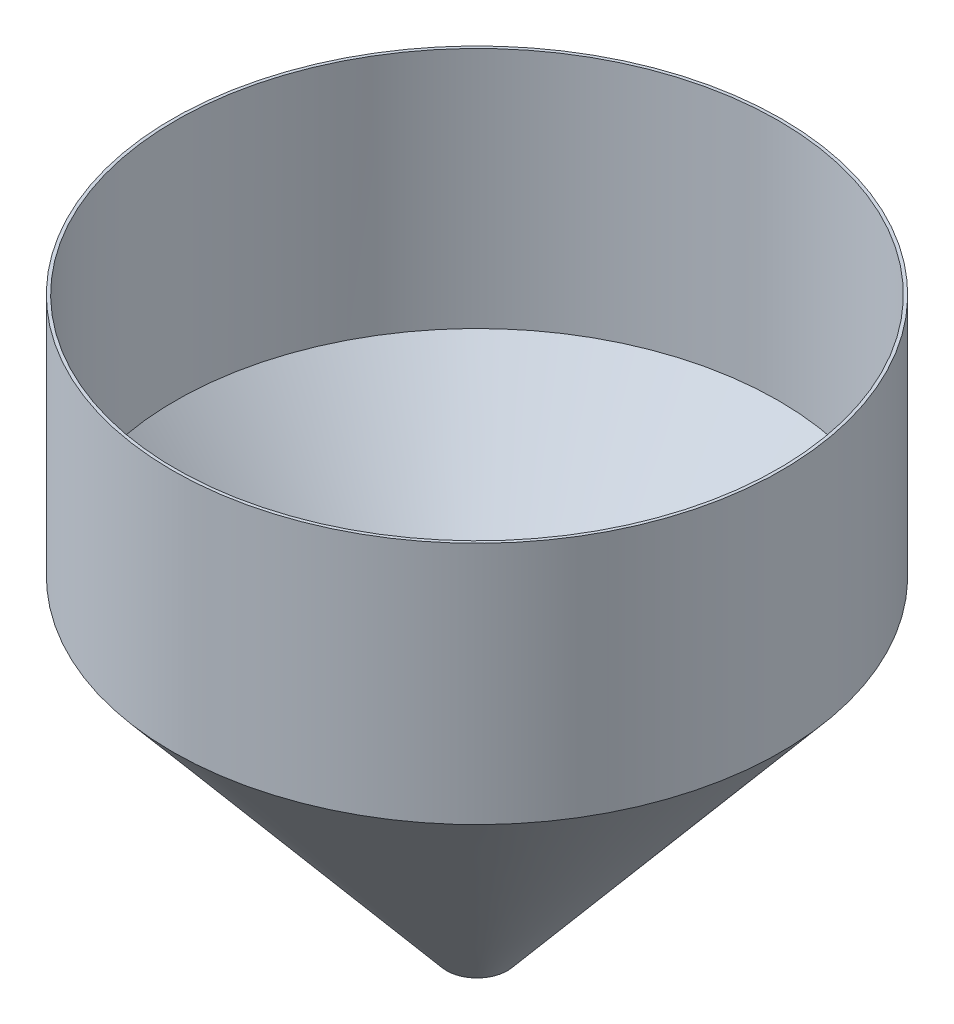
ISO-10303-21;
HEADER;
FILE_DESCRIPTION(('STEP AP214'),'2;1');
FILE_NAME('part.step','',(''),(''),'','','');
FILE_SCHEMA(('AUTOMOTIVE_DESIGN { 1 0 10303 214 1 1 1 1 }'));
ENDSEC;
DATA;
#1=APPLICATION_CONTEXT('core data for automotive mechanical design processes');
#2=APPLICATION_PROTOCOL_DEFINITION('international standard','automotive_design',2000,#1);
#3=PRODUCT_CONTEXT('',#1,'mechanical');
#4=PRODUCT('Part','Part','',(#3));
#5=PRODUCT_RELATED_PRODUCT_CATEGORY('part','',(#4));
#6=PRODUCT_DEFINITION_FORMATION('','',#4);
#7=PRODUCT_DEFINITION_CONTEXT('part definition',#1,'design');
#8=PRODUCT_DEFINITION('design','',#6,#7);
#9=PRODUCT_DEFINITION_SHAPE('','',#8);
#10=(LENGTH_UNIT() NAMED_UNIT(*) SI_UNIT(.MILLI.,.METRE.));
#11=(NAMED_UNIT(*) PLANE_ANGLE_UNIT() SI_UNIT($,.RADIAN.));
#12=(NAMED_UNIT(*) SI_UNIT($,.STERADIAN.) SOLID_ANGLE_UNIT());
#13=UNCERTAINTY_MEASURE_WITH_UNIT(LENGTH_MEASURE(1.E-05),#10,'distance_accuracy_value','');
#14=(GEOMETRIC_REPRESENTATION_CONTEXT(3) GLOBAL_UNCERTAINTY_ASSIGNED_CONTEXT((#13)) GLOBAL_UNIT_ASSIGNED_CONTEXT((#10,
#11,#12)) REPRESENTATION_CONTEXT('',''));
#15=CARTESIAN_POINT('',(0.,0.,0.));
#16=DIRECTION('',(0.,0.,1.));
#17=DIRECTION('',(1.,0.,0.));
#18=AXIS2_PLACEMENT_3D('',#15,#16,#17);
#19=CARTESIAN_POINT('',(-100.,187.257823333478,0.));
#20=DIRECTION('',(0.,-1.,0.));
#21=DIRECTION('',(0.,0.,-1.));
#22=AXIS2_PLACEMENT_3D('',#19,#20,#21);
#23=PLANE('',#22);
#24=CARTESIAN_POINT('',(0.,187.257823333478,0.));
#25=DIRECTION('',(0.,-1.,0.));
#26=DIRECTION('',(0.,0.,-1.));
#27=AXIS2_PLACEMENT_3D('',#24,#25,#26);
#28=CIRCLE('',#27,99.);
#29=CARTESIAN_POINT('',(0.,187.257823333478,-99.));
#30=VERTEX_POINT('',#29);
#31=EDGE_CURVE('E63',#30,#30,#28,.T.);
#32=ORIENTED_EDGE('',*,*,#31,.T.);
#33=EDGE_LOOP('',(#32));
#34=FACE_BOUND('',#33,.T.);
#35=CARTESIAN_POINT('',(0.,187.257823333478,0.));
#36=DIRECTION('',(0.,-1.,0.));
#37=DIRECTION('',(0.,0.,-1.));
#38=AXIS2_PLACEMENT_3D('',#35,#36,#37);
#39=CIRCLE('',#38,100.);
#40=CARTESIAN_POINT('',(0.,187.257823333478,-100.));
#41=VERTEX_POINT('',#40);
#42=EDGE_CURVE('E55',#41,#41,#39,.T.);
#43=ORIENTED_EDGE('',*,*,#42,.F.);
#44=EDGE_LOOP('',(#43));
#45=FACE_BOUND('',#44,.T.);
#46=ADVANCED_FACE('F43',(#34,#45),#23,.F.);
#47=CARTESIAN_POINT('',(0.,0.,0.));
#48=DIRECTION('',(0.,1.,0.));
#49=DIRECTION('',(0.,0.,1.));
#50=AXIS2_PLACEMENT_3D('',#47,#48,#49);
#51=PLANE('',#50);
#52=CARTESIAN_POINT('',(0.,0.,0.));
#53=DIRECTION('',(0.,1.,0.));
#54=DIRECTION('',(0.,0.,1.));
#55=AXIS2_PLACEMENT_3D('',#52,#53,#54);
#56=CIRCLE('',#55,8.69459271066771);
#57=CARTESIAN_POINT('',(0.,0.,8.69459271066769));
#58=VERTEX_POINT('',#57);
#59=EDGE_CURVE('E60',#58,#58,#56,.F.);
#60=ORIENTED_EDGE('',*,*,#59,.F.);
#61=EDGE_LOOP('',(#60));
#62=FACE_BOUND('',#61,.T.);
#63=CARTESIAN_POINT('',(0.,0.,0.));
#64=DIRECTION('',(0.,-1.,0.));
#65=DIRECTION('',(0.,0.,-1.));
#66=AXIS2_PLACEMENT_3D('',#63,#64,#65);
#67=CIRCLE('',#66,9.99999999999998);
#68=CARTESIAN_POINT('',(0.,0.,9.99999999999998));
#69=VERTEX_POINT('',#68);
#70=EDGE_CURVE('E10',#69,#69,#67,.T.);
#71=ORIENTED_EDGE('',*,*,#70,.T.);
#72=EDGE_LOOP('',(#71));
#73=FACE_BOUND('',#72,.T.);
#74=ADVANCED_FACE('F93',(#62,#73),#51,.F.);
#75=CARTESIAN_POINT('',(0.,107.257823333478,0.));
#76=DIRECTION('',(0.,1.,0.));
#77=DIRECTION('',(0.,0.,1.));
#78=AXIS2_PLACEMENT_3D('',#75,#76,#77);
#79=CONICAL_SURFACE('',#78,100.,0.698131700797737);
#80=CARTESIAN_POINT('',(0.,107.257823333478,0.));
#81=DIRECTION('',(0.,-1.,0.));
#82=DIRECTION('',(0.,0.,-1.));
#83=AXIS2_PLACEMENT_3D('',#80,#81,#82);
#84=CIRCLE('',#83,100.);
#85=CARTESIAN_POINT('',(0.,107.257823333478,100.));
#86=VERTEX_POINT('',#85);
#87=EDGE_CURVE('E50',#86,#86,#84,.T.);
#88=CARTESIAN_POINT('',(0.,0.,9.99999999999998));
#89=CARTESIAN_POINT('',(0.,1.11726899305705,10.9375));
#90=CARTESIAN_POINT('',(0.,2.23453798611411,11.875));
#91=CARTESIAN_POINT('',(0.,4.46907597222823,13.75));
#92=CARTESIAN_POINT('',(0.,5.5863449652853,14.6875));
#93=CARTESIAN_POINT('',(0.,7.82088295139942,16.5625));
#94=CARTESIAN_POINT('',(0.,8.93815194445648,17.5));
#95=CARTESIAN_POINT('',(0.,11.1726899305706,19.375));
#96=CARTESIAN_POINT('',(0.,12.2899589236276,20.3125));
#97=CARTESIAN_POINT('',(0.,14.5244969097418,22.1875));
#98=CARTESIAN_POINT('',(0.,15.6417659027988,23.125));
#99=CARTESIAN_POINT('',(0.,17.876303888913,25.));
#100=CARTESIAN_POINT('',(0.,18.99357288197,25.9375));
#101=CARTESIAN_POINT('',(0.,21.2281108680841,27.8125));
#102=CARTESIAN_POINT('',(0.,22.3453798611412,28.75));
#103=CARTESIAN_POINT('',(0.,24.5799178472553,30.625));
#104=CARTESIAN_POINT('',(0.,25.6971868403124,31.5625));
#105=CARTESIAN_POINT('',(0.,27.9317248264265,33.4375));
#106=CARTESIAN_POINT('',(0.,29.0489938194835,34.375));
#107=CARTESIAN_POINT('',(0.,31.2835318055977,36.25));
#108=CARTESIAN_POINT('',(0.,32.4008007986547,37.1875));
#109=CARTESIAN_POINT('',(0.,34.6353387847688,39.0625));
#110=CARTESIAN_POINT('',(0.,35.7526077778259,40.));
#111=CARTESIAN_POINT('',(0.,37.98714576394,41.875));
#112=CARTESIAN_POINT('',(0.,39.1044147569971,42.8125));
#113=CARTESIAN_POINT('',(0.,41.3389527431112,44.6875));
#114=CARTESIAN_POINT('',(0.,42.4562217361683,45.625));
#115=CARTESIAN_POINT('',(0.,44.6907597222824,47.5));
#116=CARTESIAN_POINT('',(0.,45.8080287153394,48.4375));
#117=CARTESIAN_POINT('',(0.,48.0425667014536,50.3125));
#118=CARTESIAN_POINT('',(0.,49.1598356945106,51.25));
#119=CARTESIAN_POINT('',(0.,51.3943736806247,53.125));
#120=CARTESIAN_POINT('',(0.,52.5116426736818,54.0625));
#121=CARTESIAN_POINT('',(0.,54.7461806597959,55.9375));
#122=CARTESIAN_POINT('',(0.,55.863449652853,56.875));
#123=CARTESIAN_POINT('',(0.,58.0979876389671,58.75));
#124=CARTESIAN_POINT('',(0.,59.2152566320241,59.6875));
#125=CARTESIAN_POINT('',(0.,61.4497946181383,61.5625));
#126=CARTESIAN_POINT('',(0.,62.5670636111953,62.5));
#127=CARTESIAN_POINT('',(0.,64.8016015973094,64.375));
#128=CARTESIAN_POINT('',(0.,65.9188705903665,65.3125));
#129=CARTESIAN_POINT('',(0.,68.1534085764806,67.1875));
#130=CARTESIAN_POINT('',(0.,69.2706775695377,68.125));
#131=CARTESIAN_POINT('',(0.,71.5052155556518,70.));
#132=CARTESIAN_POINT('',(0.,72.6224845487089,70.9375));
#133=CARTESIAN_POINT('',(0.,74.857022534823,72.8125));
#134=CARTESIAN_POINT('',(0.,75.97429152788,73.75));
#135=CARTESIAN_POINT('',(0.,78.2088295139941,75.625));
#136=CARTESIAN_POINT('',(0.,79.3260985070512,76.5625));
#137=CARTESIAN_POINT('',(0.,81.5606364931653,78.4375));
#138=CARTESIAN_POINT('',(0.,82.6779054862224,79.375));
#139=CARTESIAN_POINT('',(0.,84.9124434723365,81.25));
#140=CARTESIAN_POINT('',(0.,86.0297124653936,82.1875));
#141=CARTESIAN_POINT('',(0.,88.2642504515077,84.0625));
#142=CARTESIAN_POINT('',(0.,89.3815194445647,85.));
#143=CARTESIAN_POINT('',(0.,91.6160574306789,86.875));
#144=CARTESIAN_POINT('',(0.,92.7333264237359,87.8125));
#145=CARTESIAN_POINT('',(0.,94.96786440985,89.6875));
#146=CARTESIAN_POINT('',(0.,96.0851334029071,90.625));
#147=CARTESIAN_POINT('',(0.,98.3196713890212,92.5));
#148=CARTESIAN_POINT('',(0.,99.4369403820783,93.4375));
#149=CARTESIAN_POINT('',(0.,101.671478368192,95.3125));
#150=CARTESIAN_POINT('',(0.,102.788747361249,96.25));
#151=CARTESIAN_POINT('',(0.,105.023285347364,98.125));
#152=CARTESIAN_POINT('',(0.,106.140554340421,99.0625));
#153=CARTESIAN_POINT('',(0.,107.257823333478,100.));
#154=B_SPLINE_CURVE_WITH_KNOTS('',3,(#88,#89,#90,#91,#92,#93,#94,#95,#96,#97,#98,#99,#100,#101,
#102,#103,#104,#105,#106,#107,#108,#109,#110,#111,#112,#113,#114,#115,#116,#117,#118,#119,#120,
#121,#122,#123,#124,#125,#126,#127,#128,#129,#130,#131,#132,#133,#134,#135,#136,#137,#138,#139,
#140,#141,#142,#143,#144,#145,#146,#147,#148,#149,#150,#151,#152,#153),.UNSPECIFIED.,.F.,.F.,(4,
2,2,2,2,2,2,2,2,2,2,2,2,2,2,2,2,2,2,2,2,2,2,2,2,2,2,2,2,2,2,2,4),(0.,4.37547326304488,
8.75094652608977,13.1264197891346,17.5018930521795,21.8773663152244,26.2528395782693,
30.6283128413142,35.0037861043591,39.3792593674039,43.7547326304488,48.1302058934937,
52.5056791565386,56.8811524195835,61.2566256826283,65.6320989456732,70.0075722087181,
74.383045471763,78.7585187348079,83.1339919978527,87.5094652608976,91.8849385239425,
96.2604117869874,100.635885050032,105.011358313077,109.386831576122,113.762304839167,
118.137778102212,122.513251365257,126.888724628302,131.264197891346,135.639671154391,
140.015144417436),.UNSPECIFIED.);
#155=EDGE_CURVE('BSEAM89',#69,#86,#154,.T.);
#156=ORIENTED_EDGE('',*,*,#70,.F.);
#157=ORIENTED_EDGE('',*,*,#87,.T.);
#158=ORIENTED_EDGE('',*,*,#155,.T.);
#159=ORIENTED_EDGE('',*,*,#155,.F.);
#160=EDGE_LOOP('',(#156,#158,#157,#159));
#161=FACE_BOUND('',#160,.T.);
#162=ADVANCED_FACE('F89',(#161),#79,.T.);
#163=CARTESIAN_POINT('',(0.,0.,0.));
#164=DIRECTION('',(0.,-1.,0.));
#165=DIRECTION('',(0.,0.,-1.));
#166=AXIS2_PLACEMENT_3D('',#163,#164,#165);
#167=CYLINDRICAL_SURFACE('',#166,100.);
#168=ORIENTED_EDGE('',*,*,#87,.F.);
#169=EDGE_LOOP('',(#168));
#170=FACE_BOUND('',#169,.T.);
#171=ORIENTED_EDGE('',*,*,#42,.T.);
#172=EDGE_LOOP('',(#171));
#173=FACE_BOUND('',#172,.T.);
#174=ADVANCED_FACE('F80',(#170,#173),#167,.T.);
#175=CARTESIAN_POINT('',(0.,107.900610943164,0.));
#176=DIRECTION('',(0.,1.,0.));
#177=DIRECTION('',(0.,0.,1.));
#178=AXIS2_PLACEMENT_3D('',#175,#176,#177);
#179=CONICAL_SURFACE('',#178,99.233955556881,0.698131700797737);
#180=CARTESIAN_POINT('',(0.,107.621793567744,0.));
#181=DIRECTION('',(0.,1.,0.));
#182=DIRECTION('',(0.,0.,1.));
#183=AXIS2_PLACEMENT_3D('',#180,#181,#182);
#184=CIRCLE('',#183,99.);
#185=CARTESIAN_POINT('',(0.,107.621793567744,99.));
#186=VERTEX_POINT('',#185);
#187=EDGE_CURVE('E67',#186,#186,#184,.F.);
#188=CARTESIAN_POINT('',(0.,0.,8.69459271066769));
#189=CARTESIAN_POINT('',(0.,1.12106034966398,9.63527403659824));
#190=CARTESIAN_POINT('',(0.,2.24212069932798,10.5759553625288));
#191=CARTESIAN_POINT('',(0.,4.48424139865598,12.4573180143899));
#192=CARTESIAN_POINT('',(0.,5.60530174831998,13.3979993403204));
#193=CARTESIAN_POINT('',(0.,7.84742244764798,15.2793619921815));
#194=CARTESIAN_POINT('',(0.,8.96848279731198,16.220043318112));
#195=CARTESIAN_POINT('',(0.,11.21060349664,18.1014059699731));
#196=CARTESIAN_POINT('',(0.,12.331663846304,19.0420872959037));
#197=CARTESIAN_POINT('',(0.,14.573784545632,20.9234499477648));
#198=CARTESIAN_POINT('',(0.,15.694844895296,21.8641312736953));
#199=CARTESIAN_POINT('',(0.,17.936965594624,23.7454939255564));
#200=CARTESIAN_POINT('',(0.,19.058025944288,24.6861752514869));
#201=CARTESIAN_POINT('',(0.,21.300146643616,26.567537903348));
#202=CARTESIAN_POINT('',(0.,22.42120699328,27.5082192292786));
#203=CARTESIAN_POINT('',(0.,24.663327692608,29.3895818811397));
#204=CARTESIAN_POINT('',(0.,25.784388042272,30.3302632070702));
#205=CARTESIAN_POINT('',(0.,28.0265087416,32.2116258589313));
#206=CARTESIAN_POINT('',(0.,29.147569091264,33.1523071848619));
#207=CARTESIAN_POINT('',(0.,31.389689790592,35.0336698367229));
#208=CARTESIAN_POINT('',(0.,32.510750140256,35.9743511626535));
#209=CARTESIAN_POINT('',(0.,34.752870839584,37.8557138145146));
#210=CARTESIAN_POINT('',(0.,35.873931189248,38.7963951404451));
#211=CARTESIAN_POINT('',(0.,38.116051888576,40.6777577923062));
#212=CARTESIAN_POINT('',(0.,39.23711223824,41.6184391182368));
#213=CARTESIAN_POINT('',(0.,41.479232937568,43.4998017700979));
#214=CARTESIAN_POINT('',(0.,42.600293287232,44.4404830960284));
#215=CARTESIAN_POINT('',(0.,44.84241398656,46.3218457478895));
#216=CARTESIAN_POINT('',(0.,45.963474336224,47.26252707382));
#217=CARTESIAN_POINT('',(0.,48.205595035552,49.1438897256811));
#218=CARTESIAN_POINT('',(0.,49.326655385216,50.0845710516117));
#219=CARTESIAN_POINT('',(0.,51.5687760845439,51.9659337034727));
#220=CARTESIAN_POINT('',(0.,52.689836434208,52.9066150294033));
#221=CARTESIAN_POINT('',(0.,54.931957133536,54.7879776812644));
#222=CARTESIAN_POINT('',(0.,56.0530174832,55.7286590071949));
#223=CARTESIAN_POINT('',(0.,58.2951381825279,57.610021659056));
#224=CARTESIAN_POINT('',(0.,59.4161985321919,58.5507029849866));
#225=CARTESIAN_POINT('',(0.,61.6583192315199,60.4320656368477));
#226=CARTESIAN_POINT('',(0.,62.7793795811839,61.3727469627782));
#227=CARTESIAN_POINT('',(0.,65.0215002805119,63.2541096146393));
#228=CARTESIAN_POINT('',(0.,66.1425606301759,64.1947909405698));
#229=CARTESIAN_POINT('',(0.,68.3846813295039,66.0761535924309));
#230=CARTESIAN_POINT('',(0.,69.5057416791679,67.0168349183615));
#231=CARTESIAN_POINT('',(0.,71.7478623784959,68.8981975702226));
#232=CARTESIAN_POINT('',(0.,72.8689227281599,69.8388788961531));
#233=CARTESIAN_POINT('',(0.,75.1110434274879,71.7202415480142));
#234=CARTESIAN_POINT('',(0.,76.2321037771519,72.6609228739447));
#235=CARTESIAN_POINT('',(0.,78.4742244764799,74.5422855258058));
#236=CARTESIAN_POINT('',(0.,79.5952848261439,75.4829668517364));
#237=CARTESIAN_POINT('',(0.,81.8374055254719,77.3643295035975));
#238=CARTESIAN_POINT('',(0.,82.9584658751359,78.305010829528));
#239=CARTESIAN_POINT('',(0.,85.2005865744639,80.1863734813891));
#240=CARTESIAN_POINT('',(0.,86.3216469241279,81.1270548073197));
#241=CARTESIAN_POINT('',(0.,88.5637676234559,83.0084174591807));
#242=CARTESIAN_POINT('',(0.,89.6848279731199,83.9490987851113));
#243=CARTESIAN_POINT('',(0.,91.9269486724479,85.8304614369724));
#244=CARTESIAN_POINT('',(0.,93.0480090221119,86.7711427629029));
#245=CARTESIAN_POINT('',(0.,95.2901297214399,88.652505414764));
#246=CARTESIAN_POINT('',(0.,96.4111900711039,89.5931867406945));
#247=CARTESIAN_POINT('',(0.,98.6533107704319,91.4745493925556));
#248=CARTESIAN_POINT('',(0.,99.7743711200959,92.4152307184862));
#249=CARTESIAN_POINT('',(0.,102.016491819424,94.2965933703473));
#250=CARTESIAN_POINT('',(0.,103.137552169088,95.2372746962778));
#251=CARTESIAN_POINT('',(0.,105.379672868416,97.1186373481389));
#252=CARTESIAN_POINT('',(0.,106.50073321808,98.0593186740695));
#253=CARTESIAN_POINT('',(0.,107.621793567744,99.));
#254=B_SPLINE_CURVE_WITH_KNOTS('',3,(#188,#189,#190,#191,#192,#193,#194,#195,#196,#197,#198,
#199,#200,#201,#202,#203,#204,#205,#206,#207,#208,#209,#210,#211,#212,#213,#214,#215,#216,#217,
#218,#219,#220,#221,#222,#223,#224,#225,#226,#227,#228,#229,#230,#231,#232,#233,#234,#235,#236,
#237,#238,#239,#240,#241,#242,#243,#244,#245,#246,#247,#248,#249,#250,#251,#252,#253),
.UNSPECIFIED.,.F.,.F.,(4,2,2,2,2,2,2,2,2,2,2,2,2,2,2,2,2,2,2,2,2,2,2,2,2,2,2,2,2,2,2,2,4),(0.,
4.39032105669835,8.7806421133967,13.1709631700951,17.5612842267934,21.9516052834918,
26.3419263401901,30.7322473968885,35.1225684535868,39.5128895102852,43.9032105669835,
48.2935316236819,52.6838526803802,57.0741737370786,61.464494793777,65.8548158504753,
70.2451369071737,74.635457963872,79.0257790205704,83.4161000772687,87.8064211339671,
92.1967421906654,96.5870632473638,100.977384304062,105.36770536076,109.758026417459,
114.148347474157,118.538668530856,122.928989587554,127.319310644252,131.709631700951,
136.099952757649,140.490273814347),.UNSPECIFIED.);
#255=EDGE_CURVE('BSEAM78',#58,#186,#254,.T.);
#256=ORIENTED_EDGE('',*,*,#59,.T.);
#257=ORIENTED_EDGE('',*,*,#187,.F.);
#258=ORIENTED_EDGE('',*,*,#255,.T.);
#259=ORIENTED_EDGE('',*,*,#255,.F.);
#260=EDGE_LOOP('',(#256,#258,#257,#259));
#261=FACE_BOUND('',#260,.T.);
#262=ADVANCED_FACE('F78',(#261),#179,.F.);
#263=CARTESIAN_POINT('',(0.,0.,0.));
#264=DIRECTION('',(0.,-1.,0.));
#265=DIRECTION('',(0.,0.,-1.));
#266=AXIS2_PLACEMENT_3D('',#263,#264,#265);
#267=CYLINDRICAL_SURFACE('',#266,99.);
#268=ORIENTED_EDGE('',*,*,#187,.T.);
#269=EDGE_LOOP('',(#268));
#270=FACE_BOUND('',#269,.T.);
#271=ORIENTED_EDGE('',*,*,#31,.F.);
#272=EDGE_LOOP('',(#271));
#273=FACE_BOUND('',#272,.T.);
#274=ADVANCED_FACE('F75',(#270,#273),#267,.F.);
#275=CLOSED_SHELL('',(#46,#74,#162,#174,#262,#274));
#276=MANIFOLD_SOLID_BREP('B2',#275);
#277=ADVANCED_BREP_SHAPE_REPRESENTATION('',(#18,#276),#14);
#278=SHAPE_DEFINITION_REPRESENTATION(#9,#277);
ENDSEC;
END-ISO-10303-21;
